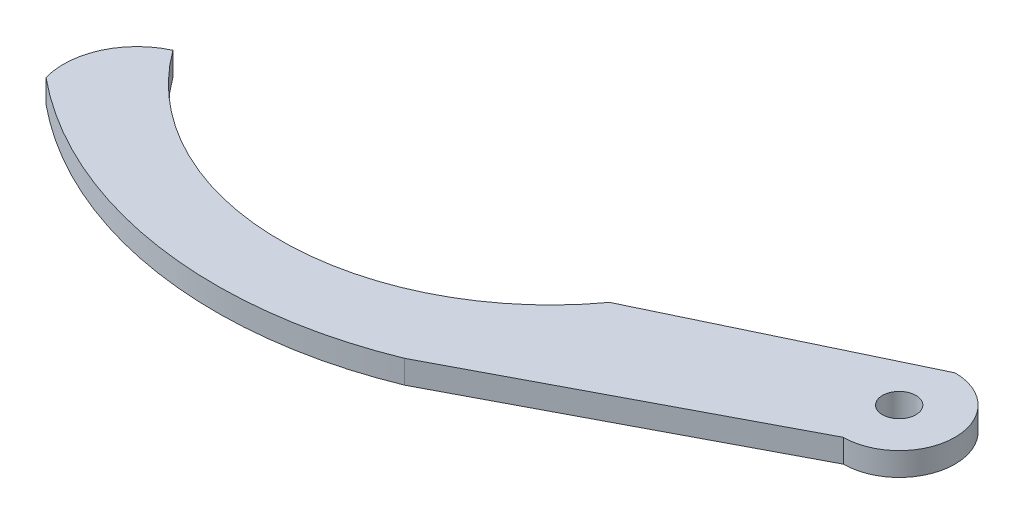
ISO-10303-21;
HEADER;
FILE_DESCRIPTION(('STEP AP214'),'2;1');
FILE_NAME('part.step','',(''),(''),'','','');
FILE_SCHEMA(('AUTOMOTIVE_DESIGN { 1 0 10303 214 1 1 1 1 }'));
ENDSEC;
DATA;
#1=APPLICATION_CONTEXT('core data for automotive mechanical design processes');
#2=APPLICATION_PROTOCOL_DEFINITION('international standard','automotive_design',2000,#1);
#3=PRODUCT_CONTEXT('',#1,'mechanical');
#4=PRODUCT('Part','Part','',(#3));
#5=PRODUCT_RELATED_PRODUCT_CATEGORY('part','',(#4));
#6=PRODUCT_DEFINITION_FORMATION('','',#4);
#7=PRODUCT_DEFINITION_CONTEXT('part definition',#1,'design');
#8=PRODUCT_DEFINITION('design','',#6,#7);
#9=PRODUCT_DEFINITION_SHAPE('','',#8);
#10=(LENGTH_UNIT() NAMED_UNIT(*) SI_UNIT(.MILLI.,.METRE.));
#11=(NAMED_UNIT(*) PLANE_ANGLE_UNIT() SI_UNIT($,.RADIAN.));
#12=(NAMED_UNIT(*) SI_UNIT($,.STERADIAN.) SOLID_ANGLE_UNIT());
#13=UNCERTAINTY_MEASURE_WITH_UNIT(LENGTH_MEASURE(1.E-05),#10,'distance_accuracy_value','');
#14=(GEOMETRIC_REPRESENTATION_CONTEXT(3) GLOBAL_UNCERTAINTY_ASSIGNED_CONTEXT((#13)) GLOBAL_UNIT_ASSIGNED_CONTEXT((#10,
#11,#12)) REPRESENTATION_CONTEXT('',''));
#15=CARTESIAN_POINT('',(0.,0.,0.));
#16=DIRECTION('',(0.,0.,1.));
#17=DIRECTION('',(1.,0.,0.));
#18=AXIS2_PLACEMENT_3D('',#15,#16,#17);
#19=CARTESIAN_POINT('',(0.,3.175,0.));
#20=DIRECTION('',(0.,-1.,0.));
#21=DIRECTION('',(0.,0.,-1.));
#22=AXIS2_PLACEMENT_3D('',#19,#20,#21);
#23=PLANE('',#22);
#24=CARTESIAN_POINT('',(0.,3.175,0.));
#25=DIRECTION('',(0.,1.,0.));
#26=DIRECTION('',(0.,0.,-1.));
#27=AXIS2_PLACEMENT_3D('',#24,#25,#26);
#28=CIRCLE('',#27,7.62);
#29=CARTESIAN_POINT('',(0.,3.175,7.62));
#30=VERTEX_POINT('',#29);
#31=CARTESIAN_POINT('',(0.,3.175,-7.62));
#32=VERTEX_POINT('',#31);
#33=EDGE_CURVE('E132',#30,#32,#28,.T.);
#34=ORIENTED_EDGE('',*,*,#33,.T.);
#35=DIRECTION('',(-0.902308062953887,0.,0.431091822618343));
#36=VECTOR('',#35,1.);
#37=CARTESIAN_POINT('',(-31.8984823138052,3.175,7.62));
#38=LINE('',#37,#36);
#39=CARTESIAN_POINT('',(-31.8984823138052,3.175,7.62));
#40=VERTEX_POINT('',#39);
#41=EDGE_CURVE('E91',#32,#40,#38,.T.);
#42=ORIENTED_EDGE('',*,*,#41,.T.);
#43=CARTESIAN_POINT('',(-61.7000871524525,3.175,-14.1368910585322));
#44=DIRECTION('',(0.,-1.,0.));
#45=DIRECTION('',(0.,0.,-1.));
#46=AXIS2_PLACEMENT_3D('',#43,#44,#45);
#47=CIRCLE('',#46,36.8984818046994);
#48=CARTESIAN_POINT('',(-91.5016919910999,3.175,7.61999999999999));
#49=VERTEX_POINT('',#48);
#50=EDGE_CURVE('E106',#40,#49,#47,.T.);
#51=ORIENTED_EDGE('',*,*,#50,.T.);
#52=CARTESIAN_POINT('',(-87.277480811527,3.175,16.7403914788442));
#53=DIRECTION('',(0.,1.,0.));
#54=DIRECTION('',(0.,0.,1.));
#55=AXIS2_PLACEMENT_3D('',#52,#53,#54);
#56=CIRCLE('',#55,10.0511442541137);
#57=CARTESIAN_POINT('',(-96.9405250371566,3.175,19.5064495242454));
#58=VERTEX_POINT('',#57);
#59=EDGE_CURVE('E99',#49,#58,#56,.T.);
#60=ORIENTED_EDGE('',*,*,#59,.T.);
#61=CARTESIAN_POINT('',(-60.8003335467179,3.175,-24.483079312126));
#62=DIRECTION('',(0.,1.,0.));
#63=DIRECTION('',(0.,0.,-1.));
#64=AXIS2_PLACEMENT_3D('',#61,#62,#63);
#65=CIRCLE('',#64,56.9314683475802);
#66=CARTESIAN_POINT('',(-39.2666435235896,3.175,28.2188398388817));
#67=VERTEX_POINT('',#66);
#68=EDGE_CURVE('E102',#58,#67,#65,.T.);
#69=ORIENTED_EDGE('',*,*,#68,.T.);
#70=DIRECTION('',(0.885547736754055,0.,-0.464548389223094));
#71=VECTOR('',#70,1.);
#72=CARTESIAN_POINT('',(-39.2666435235896,3.175,28.2188398388817));
#73=LINE('',#72,#71);
#74=EDGE_CURVE('E57',#67,#30,#73,.T.);
#75=ORIENTED_EDGE('',*,*,#74,.T.);
#76=EDGE_LOOP('',(#34,#42,#51,#60,#69,#75));
#77=FACE_BOUND('',#76,.T.);
#78=CARTESIAN_POINT('',(0.,3.175,0.));
#79=DIRECTION('',(0.,1.,0.));
#80=DIRECTION('',(0.,0.,1.));
#81=AXIS2_PLACEMENT_3D('',#78,#79,#80);
#82=CIRCLE('',#81,2.286);
#83=CARTESIAN_POINT('',(0.,3.175,2.286));
#84=VERTEX_POINT('',#83);
#85=EDGE_CURVE('E126',#84,#84,#82,.T.);
#86=ORIENTED_EDGE('',*,*,#85,.F.);
#87=EDGE_LOOP('',(#86));
#88=FACE_BOUND('',#87,.T.);
#89=ADVANCED_FACE('F39',(#77,#88),#23,.F.);
#90=CARTESIAN_POINT('',(0.,0.,0.));
#91=DIRECTION('',(0.,-1.,0.));
#92=DIRECTION('',(0.,0.,-1.));
#93=AXIS2_PLACEMENT_3D('',#90,#91,#92);
#94=PLANE('',#93);
#95=CARTESIAN_POINT('',(0.,0.,0.));
#96=DIRECTION('',(0.,1.,0.));
#97=DIRECTION('',(0.,0.,-1.));
#98=AXIS2_PLACEMENT_3D('',#95,#96,#97);
#99=CIRCLE('',#98,7.62);
#100=CARTESIAN_POINT('',(0.,0.,7.62));
#101=VERTEX_POINT('',#100);
#102=CARTESIAN_POINT('',(0.,0.,-7.62));
#103=VERTEX_POINT('',#102);
#104=EDGE_CURVE('E122',#101,#103,#99,.T.);
#105=ORIENTED_EDGE('',*,*,#104,.F.);
#106=DIRECTION('',(0.885547736754055,0.,-0.464548389223094));
#107=VECTOR('',#106,1.);
#108=CARTESIAN_POINT('',(-39.2666435235896,0.,28.2188398388817));
#109=LINE('',#108,#107);
#110=CARTESIAN_POINT('',(-39.2666435235896,0.,28.2188398388817));
#111=VERTEX_POINT('',#110);
#112=EDGE_CURVE('E84',#111,#101,#109,.T.);
#113=ORIENTED_EDGE('',*,*,#112,.F.);
#114=CARTESIAN_POINT('',(-60.8003335467179,0.,-24.483079312126));
#115=DIRECTION('',(0.,1.,0.));
#116=DIRECTION('',(0.,0.,-1.));
#117=AXIS2_PLACEMENT_3D('',#114,#115,#116);
#118=CIRCLE('',#117,56.9314683475802);
#119=CARTESIAN_POINT('',(-96.9405250371566,0.,19.5064495242454));
#120=VERTEX_POINT('',#119);
#121=EDGE_CURVE('E78',#120,#111,#118,.T.);
#122=ORIENTED_EDGE('',*,*,#121,.F.);
#123=CARTESIAN_POINT('',(-87.277480811527,0.,16.7403914788442));
#124=DIRECTION('',(0.,1.,0.));
#125=DIRECTION('',(0.,0.,1.));
#126=AXIS2_PLACEMENT_3D('',#123,#124,#125);
#127=CIRCLE('',#126,10.0511442541137);
#128=CARTESIAN_POINT('',(-91.5016919910999,0.,7.61999999999999));
#129=VERTEX_POINT('',#128);
#130=EDGE_CURVE('E111',#129,#120,#127,.T.);
#131=ORIENTED_EDGE('',*,*,#130,.F.);
#132=CARTESIAN_POINT('',(-61.7000871524525,0.,-14.1368910585322));
#133=DIRECTION('',(0.,-1.,0.));
#134=DIRECTION('',(0.,0.,-1.));
#135=AXIS2_PLACEMENT_3D('',#132,#133,#134);
#136=CIRCLE('',#135,36.8984818046994);
#137=CARTESIAN_POINT('',(-31.8984823138052,0.,7.62));
#138=VERTEX_POINT('',#137);
#139=EDGE_CURVE('E128',#138,#129,#136,.T.);
#140=ORIENTED_EDGE('',*,*,#139,.F.);
#141=DIRECTION('',(-0.902308062953887,0.,0.431091822618343));
#142=VECTOR('',#141,1.);
#143=CARTESIAN_POINT('',(-31.8984823138052,0.,7.62));
#144=LINE('',#143,#142);
#145=EDGE_CURVE('E130',#103,#138,#144,.T.);
#146=ORIENTED_EDGE('',*,*,#145,.F.);
#147=EDGE_LOOP('',(#105,#113,#122,#131,#140,#146));
#148=FACE_BOUND('',#147,.T.);
#149=CARTESIAN_POINT('',(0.,0.,0.));
#150=DIRECTION('',(0.,1.,0.));
#151=DIRECTION('',(0.,0.,1.));
#152=AXIS2_PLACEMENT_3D('',#149,#150,#151);
#153=CIRCLE('',#152,2.286);
#154=CARTESIAN_POINT('',(0.,0.,2.286));
#155=VERTEX_POINT('',#154);
#156=EDGE_CURVE('E230',#155,#155,#153,.T.);
#157=ORIENTED_EDGE('',*,*,#156,.T.);
#158=EDGE_LOOP('',(#157));
#159=FACE_BOUND('',#158,.T.);
#160=ADVANCED_FACE('F145',(#148,#159),#94,.T.);
#161=CARTESIAN_POINT('',(0.,3.175,0.));
#162=DIRECTION('',(0.,-1.,0.));
#163=DIRECTION('',(0.,0.,-1.));
#164=AXIS2_PLACEMENT_3D('',#161,#162,#163);
#165=CYLINDRICAL_SURFACE('',#164,7.62);
#166=ORIENTED_EDGE('',*,*,#104,.T.);
#167=DIRECTION('',(0.,-1.,0.));
#168=VECTOR('',#167,1.);
#169=CARTESIAN_POINT('',(0.,3.175,-7.62));
#170=LINE('',#169,#168);
#171=EDGE_CURVE('E11',#32,#103,#170,.T.);
#172=ORIENTED_EDGE('',*,*,#171,.F.);
#173=ORIENTED_EDGE('',*,*,#33,.F.);
#174=DIRECTION('',(0.,-1.,0.));
#175=VECTOR('',#174,1.);
#176=CARTESIAN_POINT('',(0.,3.175,7.62));
#177=LINE('',#176,#175);
#178=EDGE_CURVE('E117',#30,#101,#177,.T.);
#179=ORIENTED_EDGE('',*,*,#178,.T.);
#180=EDGE_LOOP('',(#166,#172,#173,#179));
#181=FACE_BOUND('',#180,.T.);
#182=ADVANCED_FACE('F41',(#181),#165,.T.);
#183=CARTESIAN_POINT('',(-31.8984823138052,3.175,7.62));
#184=DIRECTION('',(0.431091822618343,0.,0.902308062953887));
#185=DIRECTION('',(0.902308062953887,0.,-0.431091822618343));
#186=AXIS2_PLACEMENT_3D('',#183,#184,#185);
#187=PLANE('',#186);
#188=ORIENTED_EDGE('',*,*,#145,.T.);
#189=DIRECTION('',(0.,-1.,0.));
#190=VECTOR('',#189,1.);
#191=CARTESIAN_POINT('',(-31.8984823138052,3.175,7.62));
#192=LINE('',#191,#190);
#193=EDGE_CURVE('E48',#40,#138,#192,.T.);
#194=ORIENTED_EDGE('',*,*,#193,.F.);
#195=ORIENTED_EDGE('',*,*,#41,.F.);
#196=ORIENTED_EDGE('',*,*,#171,.T.);
#197=EDGE_LOOP('',(#188,#194,#195,#196));
#198=FACE_BOUND('',#197,.T.);
#199=ADVANCED_FACE('F166',(#198),#187,.F.);
#200=CARTESIAN_POINT('',(-61.7000871524525,3.175,-14.1368910585322));
#201=DIRECTION('',(0.,-1.,0.));
#202=DIRECTION('',(0.,0.,-1.));
#203=AXIS2_PLACEMENT_3D('',#200,#201,#202);
#204=CYLINDRICAL_SURFACE('',#203,36.8984818046994);
#205=ORIENTED_EDGE('',*,*,#139,.T.);
#206=DIRECTION('',(0.,-1.,0.));
#207=VECTOR('',#206,1.);
#208=CARTESIAN_POINT('',(-91.5016919910999,3.175,7.61999999999999));
#209=LINE('',#208,#207);
#210=EDGE_CURVE('E113',#49,#129,#209,.T.);
#211=ORIENTED_EDGE('',*,*,#210,.F.);
#212=ORIENTED_EDGE('',*,*,#50,.F.);
#213=ORIENTED_EDGE('',*,*,#193,.T.);
#214=EDGE_LOOP('',(#205,#211,#212,#213));
#215=FACE_BOUND('',#214,.T.);
#216=ADVANCED_FACE('F143',(#215),#204,.F.);
#217=CARTESIAN_POINT('',(-87.277480811527,3.175,16.7403914788442));
#218=DIRECTION('',(0.,-1.,0.));
#219=DIRECTION('',(0.,0.,-1.));
#220=AXIS2_PLACEMENT_3D('',#217,#218,#219);
#221=CYLINDRICAL_SURFACE('',#220,10.0511442541137);
#222=ORIENTED_EDGE('',*,*,#130,.T.);
#223=DIRECTION('',(0.,-1.,0.));
#224=VECTOR('',#223,1.);
#225=CARTESIAN_POINT('',(-96.9405250371566,3.175,19.5064495242454));
#226=LINE('',#225,#224);
#227=EDGE_CURVE('E112',#58,#120,#226,.T.);
#228=ORIENTED_EDGE('',*,*,#227,.F.);
#229=ORIENTED_EDGE('',*,*,#59,.F.);
#230=ORIENTED_EDGE('',*,*,#210,.T.);
#231=EDGE_LOOP('',(#222,#228,#229,#230));
#232=FACE_BOUND('',#231,.T.);
#233=ADVANCED_FACE('F115',(#232),#221,.T.);
#234=CARTESIAN_POINT('',(-60.8003335467179,3.175,-24.483079312126));
#235=DIRECTION('',(0.,-1.,0.));
#236=DIRECTION('',(0.,0.,-1.));
#237=AXIS2_PLACEMENT_3D('',#234,#235,#236);
#238=CYLINDRICAL_SURFACE('',#237,56.9314683475802);
#239=ORIENTED_EDGE('',*,*,#121,.T.);
#240=DIRECTION('',(0.,-1.,0.));
#241=VECTOR('',#240,1.);
#242=CARTESIAN_POINT('',(-39.2666435235896,3.175,28.2188398388817));
#243=LINE('',#242,#241);
#244=EDGE_CURVE('E119',#67,#111,#243,.T.);
#245=ORIENTED_EDGE('',*,*,#244,.F.);
#246=ORIENTED_EDGE('',*,*,#68,.F.);
#247=ORIENTED_EDGE('',*,*,#227,.T.);
#248=EDGE_LOOP('',(#239,#245,#246,#247));
#249=FACE_BOUND('',#248,.T.);
#250=ADVANCED_FACE('F120',(#249),#238,.T.);
#251=CARTESIAN_POINT('',(-39.2666435235896,3.175,28.2188398388817));
#252=DIRECTION('',(-0.464548389223094,0.,-0.885547736754055));
#253=DIRECTION('',(-0.885547736754055,0.,0.464548389223094));
#254=AXIS2_PLACEMENT_3D('',#251,#252,#253);
#255=PLANE('',#254);
#256=ORIENTED_EDGE('',*,*,#112,.T.);
#257=ORIENTED_EDGE('',*,*,#178,.F.);
#258=ORIENTED_EDGE('',*,*,#74,.F.);
#259=ORIENTED_EDGE('',*,*,#244,.T.);
#260=EDGE_LOOP('',(#256,#257,#258,#259));
#261=FACE_BOUND('',#260,.T.);
#262=ADVANCED_FACE('F149',(#261),#255,.F.);
#263=CARTESIAN_POINT('',(0.,3.175,0.));
#264=DIRECTION('',(0.,-1.,0.));
#265=DIRECTION('',(0.,0.,-1.));
#266=AXIS2_PLACEMENT_3D('',#263,#264,#265);
#267=CYLINDRICAL_SURFACE('',#266,2.286);
#268=ORIENTED_EDGE('',*,*,#85,.T.);
#269=EDGE_LOOP('',(#268));
#270=FACE_BOUND('',#269,.T.);
#271=ORIENTED_EDGE('',*,*,#156,.F.);
#272=EDGE_LOOP('',(#271));
#273=FACE_BOUND('',#272,.T.);
#274=ADVANCED_FACE('F151',(#270,#273),#267,.F.);
#275=CLOSED_SHELL('',(#89,#160,#182,#199,#216,#233,#250,#262,#274));
#276=MANIFOLD_SOLID_BREP('B2',#275);
#277=ADVANCED_BREP_SHAPE_REPRESENTATION('',(#18,#276),#14);
#278=SHAPE_DEFINITION_REPRESENTATION(#9,#277);
ENDSEC;
END-ISO-10303-21;
